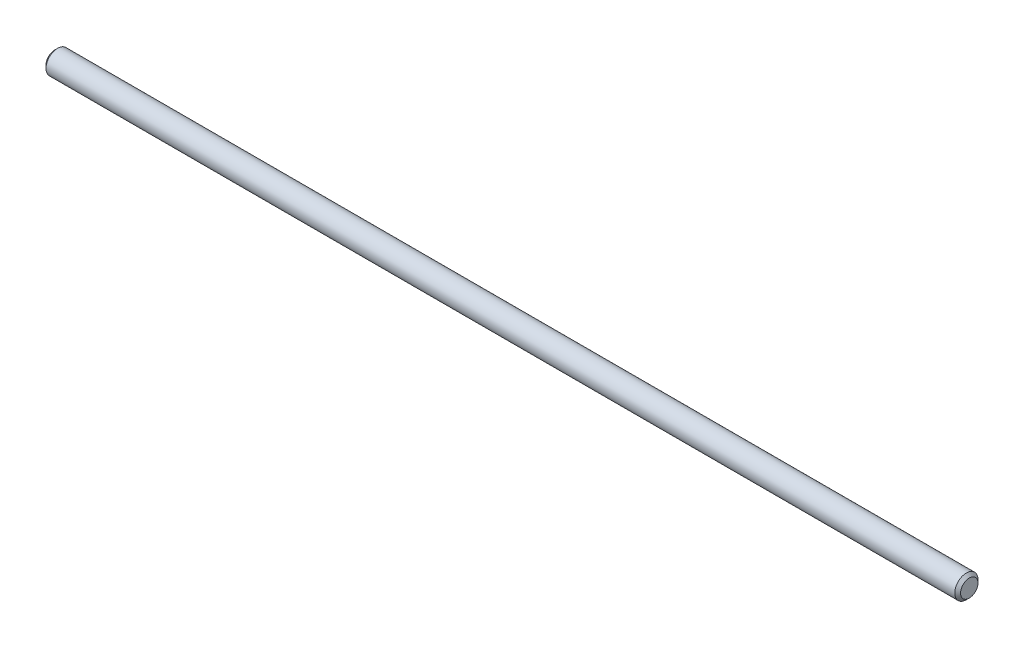
ISO-10303-21;
HEADER;
FILE_DESCRIPTION(('STEP AP214'),'2;1');
FILE_NAME('part.step','',(''),(''),'','','');
FILE_SCHEMA(('AUTOMOTIVE_DESIGN { 1 0 10303 214 1 1 1 1 }'));
ENDSEC;
DATA;
#1=APPLICATION_CONTEXT('core data for automotive mechanical design processes');
#2=APPLICATION_PROTOCOL_DEFINITION('international standard','automotive_design',2000,#1);
#3=PRODUCT_CONTEXT('',#1,'mechanical');
#4=PRODUCT('Part','Part','',(#3));
#5=PRODUCT_RELATED_PRODUCT_CATEGORY('part','',(#4));
#6=PRODUCT_DEFINITION_FORMATION('','',#4);
#7=PRODUCT_DEFINITION_CONTEXT('part definition',#1,'design');
#8=PRODUCT_DEFINITION('design','',#6,#7);
#9=PRODUCT_DEFINITION_SHAPE('','',#8);
#10=(LENGTH_UNIT() NAMED_UNIT(*) SI_UNIT(.MILLI.,.METRE.));
#11=(NAMED_UNIT(*) PLANE_ANGLE_UNIT() SI_UNIT($,.RADIAN.));
#12=(NAMED_UNIT(*) SI_UNIT($,.STERADIAN.) SOLID_ANGLE_UNIT());
#13=UNCERTAINTY_MEASURE_WITH_UNIT(LENGTH_MEASURE(1.E-05),#10,'distance_accuracy_value','');
#14=(GEOMETRIC_REPRESENTATION_CONTEXT(3) GLOBAL_UNCERTAINTY_ASSIGNED_CONTEXT((#13)) GLOBAL_UNIT_ASSIGNED_CONTEXT((#10,
#11,#12)) REPRESENTATION_CONTEXT('',''));
#15=CARTESIAN_POINT('',(0.,0.,0.));
#16=DIRECTION('',(0.,0.,1.));
#17=DIRECTION('',(1.,0.,0.));
#18=AXIS2_PLACEMENT_3D('',#15,#16,#17);
#19=CARTESIAN_POINT('',(315.,0.,0.));
#20=DIRECTION('',(-1.,0.,0.));
#21=DIRECTION('',(0.,0.,1.));
#22=AXIS2_PLACEMENT_3D('',#19,#20,#21);
#23=CYLINDRICAL_SURFACE('',#22,4.);
#24=CARTESIAN_POINT('',(314.,0.,0.));
#25=DIRECTION('',(1.,0.,0.));
#26=DIRECTION('',(0.,0.,-1.));
#27=AXIS2_PLACEMENT_3D('',#24,#25,#26);
#28=CIRCLE('',#27,4.);
#29=CARTESIAN_POINT('',(314.,0.,-4.));
#30=VERTEX_POINT('',#29);
#31=EDGE_CURVE('E41',#30,#30,#28,.F.);
#32=ORIENTED_EDGE('',*,*,#31,.T.);
#33=EDGE_LOOP('',(#32));
#34=FACE_BOUND('',#33,.T.);
#35=CARTESIAN_POINT('',(1.,0.,0.));
#36=DIRECTION('',(1.,0.,0.));
#37=DIRECTION('',(0.,0.,-1.));
#38=AXIS2_PLACEMENT_3D('',#35,#36,#37);
#39=CIRCLE('',#38,4.);
#40=CARTESIAN_POINT('',(1.,0.,-4.));
#41=VERTEX_POINT('',#40);
#42=EDGE_CURVE('E45',#41,#41,#39,.T.);
#43=ORIENTED_EDGE('',*,*,#42,.T.);
#44=EDGE_LOOP('',(#43));
#45=FACE_BOUND('',#44,.T.);
#46=ADVANCED_FACE('F34',(#34,#45),#23,.T.);
#47=CARTESIAN_POINT('',(315.,0.,0.));
#48=DIRECTION('',(1.,0.,0.));
#49=DIRECTION('',(0.,0.,-1.));
#50=AXIS2_PLACEMENT_3D('',#47,#48,#49);
#51=PLANE('',#50);
#52=CARTESIAN_POINT('',(315.,0.,0.));
#53=DIRECTION('',(1.,0.,0.));
#54=DIRECTION('',(0.,0.,-1.));
#55=AXIS2_PLACEMENT_3D('',#52,#53,#54);
#56=CIRCLE('',#55,3.00000000000003);
#57=CARTESIAN_POINT('',(315.,0.,-3.00000000000003));
#58=VERTEX_POINT('',#57);
#59=EDGE_CURVE('E49',#58,#58,#56,.T.);
#60=ORIENTED_EDGE('',*,*,#59,.T.);
#61=EDGE_LOOP('',(#60));
#62=FACE_BOUND('',#61,.T.);
#63=ADVANCED_FACE('F55',(#62),#51,.T.);
#64=CARTESIAN_POINT('',(0.,0.,0.));
#65=DIRECTION('',(1.,0.,0.));
#66=DIRECTION('',(0.,0.,-1.));
#67=AXIS2_PLACEMENT_3D('',#64,#65,#66);
#68=PLANE('',#67);
#69=CARTESIAN_POINT('',(0.,0.,0.));
#70=DIRECTION('',(1.,0.,0.));
#71=DIRECTION('',(0.,0.,-1.));
#72=AXIS2_PLACEMENT_3D('',#69,#70,#71);
#73=CIRCLE('',#72,3.);
#74=CARTESIAN_POINT('',(0.,0.,-3.));
#75=VERTEX_POINT('',#74);
#76=EDGE_CURVE('E10',#75,#75,#73,.F.);
#77=ORIENTED_EDGE('',*,*,#76,.T.);
#78=EDGE_LOOP('',(#77));
#79=FACE_BOUND('',#78,.T.);
#80=ADVANCED_FACE('F59',(#79),#68,.F.);
#81=CARTESIAN_POINT('',(315.,0.,0.));
#82=DIRECTION('',(-1.,0.,0.));
#83=DIRECTION('',(0.,0.,1.));
#84=AXIS2_PLACEMENT_3D('',#81,#82,#83);
#85=CONICAL_SURFACE('',#84,3.00000000000003,0.78539816339746);
#86=ORIENTED_EDGE('',*,*,#31,.F.);
#87=EDGE_LOOP('',(#86));
#88=FACE_BOUND('',#87,.T.);
#89=ORIENTED_EDGE('',*,*,#59,.F.);
#90=EDGE_LOOP('',(#89));
#91=FACE_BOUND('',#90,.T.);
#92=ADVANCED_FACE('F57',(#88,#91),#85,.T.);
#93=CARTESIAN_POINT('',(1.,0.,0.));
#94=DIRECTION('',(1.,0.,0.));
#95=DIRECTION('',(0.,0.,-1.));
#96=AXIS2_PLACEMENT_3D('',#93,#94,#95);
#97=CONICAL_SURFACE('',#96,4.,0.785398163397447);
#98=ORIENTED_EDGE('',*,*,#76,.F.);
#99=EDGE_LOOP('',(#98));
#100=FACE_BOUND('',#99,.T.);
#101=ORIENTED_EDGE('',*,*,#42,.F.);
#102=EDGE_LOOP('',(#101));
#103=FACE_BOUND('',#102,.T.);
#104=ADVANCED_FACE('F36',(#100,#103),#97,.T.);
#105=CLOSED_SHELL('',(#46,#63,#80,#92,#104));
#106=MANIFOLD_SOLID_BREP('B2',#105);
#107=ADVANCED_BREP_SHAPE_REPRESENTATION('',(#18,#106),#14);
#108=SHAPE_DEFINITION_REPRESENTATION(#9,#107);
ENDSEC;
END-ISO-10303-21;
